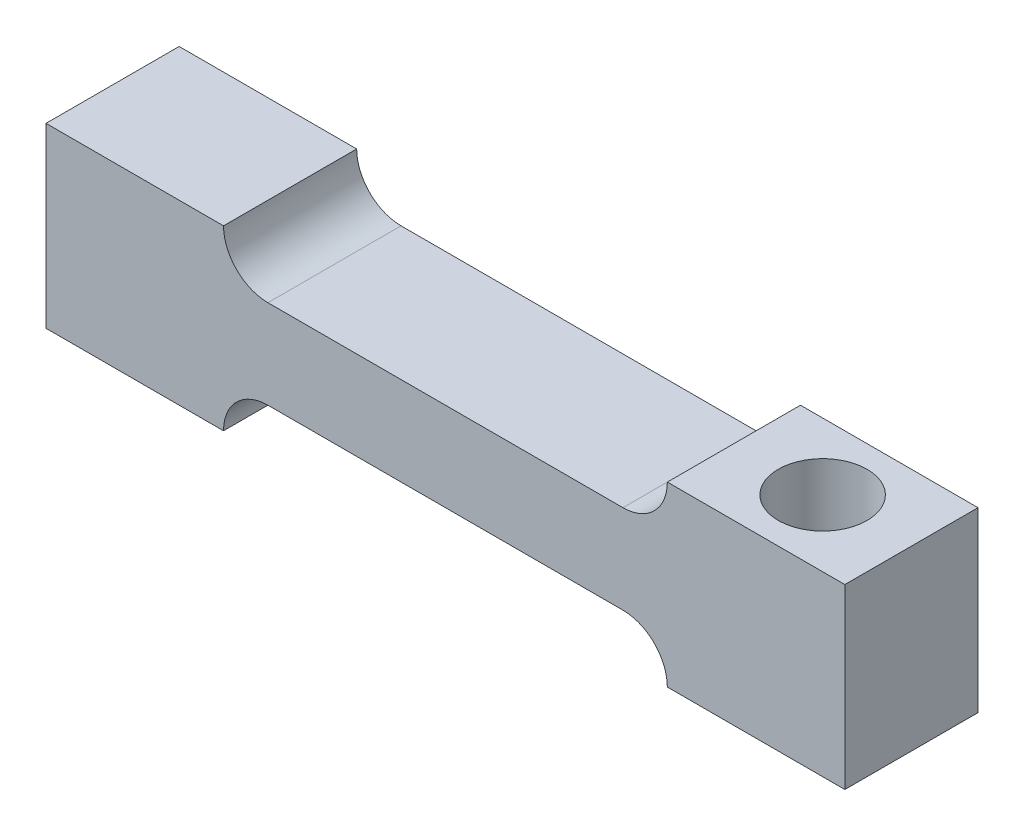
ISO-10303-21;
HEADER;
FILE_DESCRIPTION(('STEP AP214'),'2;1');
FILE_NAME('part.step','',(''),(''),'','','');
FILE_SCHEMA(('AUTOMOTIVE_DESIGN { 1 0 10303 214 1 1 1 1 }'));
ENDSEC;
DATA;
#1=APPLICATION_CONTEXT('core data for automotive mechanical design processes');
#2=APPLICATION_PROTOCOL_DEFINITION('international standard','automotive_design',2000,#1);
#3=PRODUCT_CONTEXT('',#1,'mechanical');
#4=PRODUCT('Part','Part','',(#3));
#5=PRODUCT_RELATED_PRODUCT_CATEGORY('part','',(#4));
#6=PRODUCT_DEFINITION_FORMATION('','',#4);
#7=PRODUCT_DEFINITION_CONTEXT('part definition',#1,'design');
#8=PRODUCT_DEFINITION('design','',#6,#7);
#9=PRODUCT_DEFINITION_SHAPE('','',#8);
#10=(LENGTH_UNIT() NAMED_UNIT(*) SI_UNIT(.MILLI.,.METRE.));
#11=(NAMED_UNIT(*) PLANE_ANGLE_UNIT() SI_UNIT($,.RADIAN.));
#12=(NAMED_UNIT(*) SI_UNIT($,.STERADIAN.) SOLID_ANGLE_UNIT());
#13=UNCERTAINTY_MEASURE_WITH_UNIT(LENGTH_MEASURE(1.E-05),#10,'distance_accuracy_value','');
#14=(GEOMETRIC_REPRESENTATION_CONTEXT(3) GLOBAL_UNCERTAINTY_ASSIGNED_CONTEXT((#13)) GLOBAL_UNIT_ASSIGNED_CONTEXT((#10,
#11,#12)) REPRESENTATION_CONTEXT('',''));
#15=CARTESIAN_POINT('',(0.,0.,0.));
#16=DIRECTION('',(0.,0.,1.));
#17=DIRECTION('',(1.,0.,0.));
#18=AXIS2_PLACEMENT_3D('',#15,#16,#17);
#19=CARTESIAN_POINT('',(0.,0.,30.));
#20=DIRECTION('',(-1.,0.,0.));
#21=DIRECTION('',(0.,0.,1.));
#22=AXIS2_PLACEMENT_3D('',#19,#20,#21);
#23=PLANE('',#22);
#24=DIRECTION('',(0.,1.,0.));
#25=VECTOR('',#24,1.);
#26=CARTESIAN_POINT('',(0.,0.,0.));
#27=LINE('',#26,#25);
#28=CARTESIAN_POINT('',(0.,-30.,0.));
#29=VERTEX_POINT('',#28);
#30=CARTESIAN_POINT('',(0.,10.,0.));
#31=VERTEX_POINT('',#30);
#32=EDGE_CURVE('E137',#29,#31,#27,.T.);
#33=ORIENTED_EDGE('',*,*,#32,.T.);
#34=DIRECTION('',(0.,0.,-1.));
#35=VECTOR('',#34,1.);
#36=CARTESIAN_POINT('',(0.,10.,30.));
#37=LINE('',#36,#35);
#38=CARTESIAN_POINT('',(0.,10.,30.));
#39=VERTEX_POINT('',#38);
#40=EDGE_CURVE('E136',#39,#31,#37,.T.);
#41=ORIENTED_EDGE('',*,*,#40,.F.);
#42=DIRECTION('',(0.,1.,0.));
#43=VECTOR('',#42,1.);
#44=CARTESIAN_POINT('',(0.,-30.,30.));
#45=LINE('',#44,#43);
#46=CARTESIAN_POINT('',(0.,-30.,30.));
#47=VERTEX_POINT('',#46);
#48=EDGE_CURVE('E122',#47,#39,#45,.T.);
#49=ORIENTED_EDGE('',*,*,#48,.F.);
#50=DIRECTION('',(0.,0.,-1.));
#51=VECTOR('',#50,1.);
#52=CARTESIAN_POINT('',(0.,-30.,30.));
#53=LINE('',#52,#51);
#54=EDGE_CURVE('E161',#47,#29,#53,.T.);
#55=ORIENTED_EDGE('',*,*,#54,.T.);
#56=EDGE_LOOP('',(#33,#41,#49,#55));
#57=FACE_BOUND('',#56,.T.);
#58=ADVANCED_FACE('F35',(#57),#23,.F.);
#59=CARTESIAN_POINT('',(0.,10.,30.));
#60=DIRECTION('',(0.,-1.,0.));
#61=DIRECTION('',(1.,0.,0.));
#62=AXIS2_PLACEMENT_3D('',#59,#60,#61);
#63=PLANE('',#62);
#64=CARTESIAN_POINT('',(-20.,10.,15.));
#65=DIRECTION('',(0.,1.,0.));
#66=DIRECTION('',(-1.,0.,0.));
#67=AXIS2_PLACEMENT_3D('',#64,#65,#66);
#68=CIRCLE('',#67,10.);
#69=CARTESIAN_POINT('',(-30.,9.99999999999999,15.));
#70=VERTEX_POINT('',#69);
#71=EDGE_CURVE('E386',#70,#70,#68,.T.);
#72=ORIENTED_EDGE('',*,*,#71,.F.);
#73=EDGE_LOOP('',(#72));
#74=FACE_BOUND('',#73,.T.);
#75=DIRECTION('',(-1.,0.,0.));
#76=VECTOR('',#75,1.);
#77=CARTESIAN_POINT('',(0.,10.,0.));
#78=LINE('',#77,#76);
#79=CARTESIAN_POINT('',(-40.,9.99999999999999,0.));
#80=VERTEX_POINT('',#79);
#81=EDGE_CURVE('E163',#31,#80,#78,.T.);
#82=ORIENTED_EDGE('',*,*,#81,.T.);
#83=DIRECTION('',(0.,0.,-1.));
#84=VECTOR('',#83,1.);
#85=CARTESIAN_POINT('',(-40.,9.99999999999999,30.));
#86=LINE('',#85,#84);
#87=CARTESIAN_POINT('',(-40.,9.99999999999999,30.));
#88=VERTEX_POINT('',#87);
#89=EDGE_CURVE('E142',#88,#80,#86,.T.);
#90=ORIENTED_EDGE('',*,*,#89,.F.);
#91=DIRECTION('',(-1.,0.,0.));
#92=VECTOR('',#91,1.);
#93=CARTESIAN_POINT('',(0.,10.,30.));
#94=LINE('',#93,#92);
#95=EDGE_CURVE('E126',#39,#88,#94,.T.);
#96=ORIENTED_EDGE('',*,*,#95,.F.);
#97=ORIENTED_EDGE('',*,*,#40,.T.);
#98=EDGE_LOOP('',(#82,#90,#96,#97));
#99=FACE_BOUND('',#98,.T.);
#100=ADVANCED_FACE('F144',(#74,#99),#63,.F.);
#101=CARTESIAN_POINT('',(-40.,0.,30.));
#102=DIRECTION('',(0.,-1.,0.));
#103=DIRECTION('',(1.,0.,0.));
#104=AXIS2_PLACEMENT_3D('',#101,#102,#103);
#105=PLANE('',#104);
#106=DIRECTION('',(-1.,0.,0.));
#107=VECTOR('',#106,1.);
#108=CARTESIAN_POINT('',(-40.,0.,30.));
#109=LINE('',#108,#107);
#110=CARTESIAN_POINT('',(-50.,0.,30.));
#111=VERTEX_POINT('',#110);
#112=CARTESIAN_POINT('',(-130.,0.,30.));
#113=VERTEX_POINT('',#112);
#114=EDGE_CURVE('E146',#111,#113,#109,.T.);
#115=ORIENTED_EDGE('',*,*,#114,.F.);
#116=DIRECTION('',(0.,0.,-1.));
#117=VECTOR('',#116,1.);
#118=CARTESIAN_POINT('',(-50.,0.,0.));
#119=LINE('',#118,#117);
#120=CARTESIAN_POINT('',(-50.,0.,0.));
#121=VERTEX_POINT('',#120);
#122=EDGE_CURVE('E202',#111,#121,#119,.T.);
#123=ORIENTED_EDGE('',*,*,#122,.T.);
#124=DIRECTION('',(-1.,0.,0.));
#125=VECTOR('',#124,1.);
#126=CARTESIAN_POINT('',(-40.,0.,0.));
#127=LINE('',#126,#125);
#128=CARTESIAN_POINT('',(-130.,0.,0.));
#129=VERTEX_POINT('',#128);
#130=EDGE_CURVE('E166',#121,#129,#127,.T.);
#131=ORIENTED_EDGE('',*,*,#130,.T.);
#132=DIRECTION('',(0.,0.,-1.));
#133=VECTOR('',#132,1.);
#134=CARTESIAN_POINT('',(-130.,0.,30.));
#135=LINE('',#134,#133);
#136=EDGE_CURVE('E50',#129,#113,#135,.F.);
#137=ORIENTED_EDGE('',*,*,#136,.T.);
#138=EDGE_LOOP('',(#115,#123,#131,#137));
#139=FACE_BOUND('',#138,.T.);
#140=ADVANCED_FACE('F222',(#139),#105,.F.);
#141=CARTESIAN_POINT('',(-140.,9.99999999999999,30.));
#142=DIRECTION('',(0.,-1.,0.));
#143=DIRECTION('',(1.,0.,0.));
#144=AXIS2_PLACEMENT_3D('',#141,#142,#143);
#145=PLANE('',#144);
#146=DIRECTION('',(-1.,0.,0.));
#147=VECTOR('',#146,1.);
#148=CARTESIAN_POINT('',(-140.,9.99999999999999,0.));
#149=LINE('',#148,#147);
#150=CARTESIAN_POINT('',(-140.,9.99999999999999,0.));
#151=VERTEX_POINT('',#150);
#152=CARTESIAN_POINT('',(-180.,9.99999999999999,0.));
#153=VERTEX_POINT('',#152);
#154=EDGE_CURVE('E168',#151,#153,#149,.T.);
#155=ORIENTED_EDGE('',*,*,#154,.T.);
#156=DIRECTION('',(0.,0.,-1.));
#157=VECTOR('',#156,1.);
#158=CARTESIAN_POINT('',(-180.,9.99999999999999,30.));
#159=LINE('',#158,#157);
#160=CARTESIAN_POINT('',(-180.,9.99999999999999,30.));
#161=VERTEX_POINT('',#160);
#162=EDGE_CURVE('E190',#161,#153,#159,.T.);
#163=ORIENTED_EDGE('',*,*,#162,.F.);
#164=DIRECTION('',(-1.,0.,0.));
#165=VECTOR('',#164,1.);
#166=CARTESIAN_POINT('',(-140.,9.99999999999999,30.));
#167=LINE('',#166,#165);
#168=CARTESIAN_POINT('',(-140.,9.99999999999999,30.));
#169=VERTEX_POINT('',#168);
#170=EDGE_CURVE('E148',#169,#161,#167,.T.);
#171=ORIENTED_EDGE('',*,*,#170,.F.);
#172=DIRECTION('',(0.,0.,-1.));
#173=VECTOR('',#172,1.);
#174=CARTESIAN_POINT('',(-140.,9.99999999999999,30.));
#175=LINE('',#174,#173);
#176=EDGE_CURVE('E193',#169,#151,#175,.T.);
#177=ORIENTED_EDGE('',*,*,#176,.T.);
#178=EDGE_LOOP('',(#155,#163,#171,#177));
#179=FACE_BOUND('',#178,.T.);
#180=ADVANCED_FACE('F228',(#179),#145,.F.);
#181=CARTESIAN_POINT('',(-180.,9.99999999999999,30.));
#182=DIRECTION('',(1.,0.,0.));
#183=DIRECTION('',(0.,0.,-1.));
#184=AXIS2_PLACEMENT_3D('',#181,#182,#183);
#185=PLANE('',#184);
#186=DIRECTION('',(0.,-1.,0.));
#187=VECTOR('',#186,1.);
#188=CARTESIAN_POINT('',(-180.,9.99999999999999,0.));
#189=LINE('',#188,#187);
#190=CARTESIAN_POINT('',(-180.,-30.,0.));
#191=VERTEX_POINT('',#190);
#192=EDGE_CURVE('E170',#153,#191,#189,.T.);
#193=ORIENTED_EDGE('',*,*,#192,.T.);
#194=DIRECTION('',(0.,0.,-1.));
#195=VECTOR('',#194,1.);
#196=CARTESIAN_POINT('',(-180.,-30.,30.));
#197=LINE('',#196,#195);
#198=CARTESIAN_POINT('',(-180.,-30.,30.));
#199=VERTEX_POINT('',#198);
#200=EDGE_CURVE('E187',#199,#191,#197,.T.);
#201=ORIENTED_EDGE('',*,*,#200,.F.);
#202=DIRECTION('',(0.,-1.,0.));
#203=VECTOR('',#202,1.);
#204=CARTESIAN_POINT('',(-180.,9.99999999999999,30.));
#205=LINE('',#204,#203);
#206=EDGE_CURVE('E153',#161,#199,#205,.T.);
#207=ORIENTED_EDGE('',*,*,#206,.F.);
#208=ORIENTED_EDGE('',*,*,#162,.T.);
#209=EDGE_LOOP('',(#193,#201,#207,#208));
#210=FACE_BOUND('',#209,.T.);
#211=ADVANCED_FACE('F232',(#210),#185,.F.);
#212=CARTESIAN_POINT('',(-180.,-30.,30.));
#213=DIRECTION('',(0.,1.,0.));
#214=DIRECTION('',(0.,0.,1.));
#215=AXIS2_PLACEMENT_3D('',#212,#213,#214);
#216=PLANE('',#215);
#217=DIRECTION('',(1.,0.,0.));
#218=VECTOR('',#217,1.);
#219=CARTESIAN_POINT('',(-180.,-30.,0.));
#220=LINE('',#219,#218);
#221=CARTESIAN_POINT('',(-140.,-30.,0.));
#222=VERTEX_POINT('',#221);
#223=EDGE_CURVE('E172',#191,#222,#220,.T.);
#224=ORIENTED_EDGE('',*,*,#223,.T.);
#225=DIRECTION('',(0.,0.,-1.));
#226=VECTOR('',#225,1.);
#227=CARTESIAN_POINT('',(-140.,-30.,30.));
#228=LINE('',#227,#226);
#229=CARTESIAN_POINT('',(-140.,-30.,30.));
#230=VERTEX_POINT('',#229);
#231=EDGE_CURVE('E184',#230,#222,#228,.T.);
#232=ORIENTED_EDGE('',*,*,#231,.F.);
#233=DIRECTION('',(1.,0.,0.));
#234=VECTOR('',#233,1.);
#235=CARTESIAN_POINT('',(-180.,-30.,30.));
#236=LINE('',#235,#234);
#237=EDGE_CURVE('E155',#199,#230,#236,.T.);
#238=ORIENTED_EDGE('',*,*,#237,.F.);
#239=ORIENTED_EDGE('',*,*,#200,.T.);
#240=EDGE_LOOP('',(#224,#232,#238,#239));
#241=FACE_BOUND('',#240,.T.);
#242=ADVANCED_FACE('F238',(#241),#216,.F.);
#243=CARTESIAN_POINT('',(-140.,-20.,30.));
#244=DIRECTION('',(0.,1.,0.));
#245=DIRECTION('',(-1.,0.,0.));
#246=AXIS2_PLACEMENT_3D('',#243,#244,#245);
#247=PLANE('',#246);
#248=DIRECTION('',(1.,0.,0.));
#249=VECTOR('',#248,1.);
#250=CARTESIAN_POINT('',(-140.,-20.,0.));
#251=LINE('',#250,#249);
#252=CARTESIAN_POINT('',(-130.,-20.,0.));
#253=VERTEX_POINT('',#252);
#254=CARTESIAN_POINT('',(-50.,-20.,0.));
#255=VERTEX_POINT('',#254);
#256=EDGE_CURVE('E175',#253,#255,#251,.T.);
#257=ORIENTED_EDGE('',*,*,#256,.T.);
#258=DIRECTION('',(0.,0.,-1.));
#259=VECTOR('',#258,1.);
#260=CARTESIAN_POINT('',(-50.,-20.,30.));
#261=LINE('',#260,#259);
#262=CARTESIAN_POINT('',(-50.,-20.,30.));
#263=VERTEX_POINT('',#262);
#264=EDGE_CURVE('E199',#255,#263,#261,.F.);
#265=ORIENTED_EDGE('',*,*,#264,.T.);
#266=DIRECTION('',(1.,0.,0.));
#267=VECTOR('',#266,1.);
#268=CARTESIAN_POINT('',(-140.,-20.,30.));
#269=LINE('',#268,#267);
#270=CARTESIAN_POINT('',(-130.,-20.,30.));
#271=VERTEX_POINT('',#270);
#272=EDGE_CURVE('E157',#271,#263,#269,.T.);
#273=ORIENTED_EDGE('',*,*,#272,.F.);
#274=DIRECTION('',(0.,0.,-1.));
#275=VECTOR('',#274,1.);
#276=CARTESIAN_POINT('',(-130.,-20.,0.));
#277=LINE('',#276,#275);
#278=EDGE_CURVE('E141',#271,#253,#277,.T.);
#279=ORIENTED_EDGE('',*,*,#278,.T.);
#280=EDGE_LOOP('',(#257,#265,#273,#279));
#281=FACE_BOUND('',#280,.T.);
#282=ADVANCED_FACE('F245',(#281),#247,.F.);
#283=CARTESIAN_POINT('',(-40.,-30.,30.));
#284=DIRECTION('',(0.,1.,0.));
#285=DIRECTION('',(0.,0.,1.));
#286=AXIS2_PLACEMENT_3D('',#283,#284,#285);
#287=PLANE('',#286);
#288=CARTESIAN_POINT('',(-20.,-30.,15.));
#289=DIRECTION('',(0.,1.,0.));
#290=DIRECTION('',(-1.,0.,0.));
#291=AXIS2_PLACEMENT_3D('',#288,#289,#290);
#292=CIRCLE('',#291,10.);
#293=CARTESIAN_POINT('',(-30.,-30.,15.));
#294=VERTEX_POINT('',#293);
#295=EDGE_CURVE('E164',#294,#294,#292,.T.);
#296=ORIENTED_EDGE('',*,*,#295,.T.);
#297=EDGE_LOOP('',(#296));
#298=FACE_BOUND('',#297,.T.);
#299=DIRECTION('',(1.,0.,0.));
#300=VECTOR('',#299,1.);
#301=CARTESIAN_POINT('',(-40.,-30.,0.));
#302=LINE('',#301,#300);
#303=CARTESIAN_POINT('',(-40.,-30.,0.));
#304=VERTEX_POINT('',#303);
#305=EDGE_CURVE('E133',#304,#29,#302,.T.);
#306=ORIENTED_EDGE('',*,*,#305,.T.);
#307=ORIENTED_EDGE('',*,*,#54,.F.);
#308=DIRECTION('',(1.,0.,0.));
#309=VECTOR('',#308,1.);
#310=CARTESIAN_POINT('',(-40.,-30.,30.));
#311=LINE('',#310,#309);
#312=CARTESIAN_POINT('',(-40.,-30.,30.));
#313=VERTEX_POINT('',#312);
#314=EDGE_CURVE('E129',#313,#47,#311,.T.);
#315=ORIENTED_EDGE('',*,*,#314,.F.);
#316=DIRECTION('',(0.,0.,-1.));
#317=VECTOR('',#316,1.);
#318=CARTESIAN_POINT('',(-40.,-30.,30.));
#319=LINE('',#318,#317);
#320=EDGE_CURVE('E181',#313,#304,#319,.T.);
#321=ORIENTED_EDGE('',*,*,#320,.T.);
#322=EDGE_LOOP('',(#306,#307,#315,#321));
#323=FACE_BOUND('',#322,.T.);
#324=ADVANCED_FACE('F253',(#298,#323),#287,.F.);
#325=CARTESIAN_POINT('',(0.,0.,30.));
#326=DIRECTION('',(0.,0.,1.));
#327=DIRECTION('',(1.,0.,0.));
#328=AXIS2_PLACEMENT_3D('',#325,#326,#327);
#329=PLANE('',#328);
#330=ORIENTED_EDGE('',*,*,#48,.T.);
#331=ORIENTED_EDGE('',*,*,#95,.T.);
#332=CARTESIAN_POINT('',(-50.,10.,30.));
#333=DIRECTION('',(0.,0.,1.));
#334=DIRECTION('',(1.,0.,0.));
#335=AXIS2_PLACEMENT_3D('',#332,#333,#334);
#336=CIRCLE('',#335,10.);
#337=EDGE_CURVE('E57',#88,#111,#336,.F.);
#338=ORIENTED_EDGE('',*,*,#337,.T.);
#339=ORIENTED_EDGE('',*,*,#114,.T.);
#340=CARTESIAN_POINT('',(-130.,9.99999999999999,30.));
#341=DIRECTION('',(0.,0.,1.));
#342=DIRECTION('',(1.,0.,0.));
#343=AXIS2_PLACEMENT_3D('',#340,#341,#342);
#344=CIRCLE('',#343,10.);
#345=EDGE_CURVE('E12',#113,#169,#344,.F.);
#346=ORIENTED_EDGE('',*,*,#345,.T.);
#347=ORIENTED_EDGE('',*,*,#170,.T.);
#348=ORIENTED_EDGE('',*,*,#206,.T.);
#349=ORIENTED_EDGE('',*,*,#237,.T.);
#350=CARTESIAN_POINT('',(-130.,-30.,30.));
#351=DIRECTION('',(0.,0.,1.));
#352=DIRECTION('',(1.,0.,0.));
#353=AXIS2_PLACEMENT_3D('',#350,#351,#352);
#354=CIRCLE('',#353,10.);
#355=EDGE_CURVE('E211',#230,#271,#354,.F.);
#356=ORIENTED_EDGE('',*,*,#355,.T.);
#357=ORIENTED_EDGE('',*,*,#272,.T.);
#358=CARTESIAN_POINT('',(-50.,-30.,30.));
#359=DIRECTION('',(0.,0.,1.));
#360=DIRECTION('',(1.,0.,0.));
#361=AXIS2_PLACEMENT_3D('',#358,#359,#360);
#362=CIRCLE('',#361,10.);
#363=EDGE_CURVE('E207',#263,#313,#362,.F.);
#364=ORIENTED_EDGE('',*,*,#363,.T.);
#365=ORIENTED_EDGE('',*,*,#314,.T.);
#366=EDGE_LOOP('',(#330,#331,#338,#339,#346,#347,#348,#349,#356,#357,#364,#365));
#367=FACE_BOUND('',#366,.T.);
#368=ADVANCED_FACE('F124',(#367),#329,.T.);
#369=CARTESIAN_POINT('',(0.,0.,0.));
#370=DIRECTION('',(0.,0.,1.));
#371=DIRECTION('',(1.,0.,0.));
#372=AXIS2_PLACEMENT_3D('',#369,#370,#371);
#373=PLANE('',#372);
#374=ORIENTED_EDGE('',*,*,#32,.F.);
#375=ORIENTED_EDGE('',*,*,#305,.F.);
#376=CARTESIAN_POINT('',(-50.,-30.,0.));
#377=DIRECTION('',(0.,0.,1.));
#378=DIRECTION('',(1.,0.,0.));
#379=AXIS2_PLACEMENT_3D('',#376,#377,#378);
#380=CIRCLE('',#379,10.);
#381=EDGE_CURVE('E205',#304,#255,#380,.T.);
#382=ORIENTED_EDGE('',*,*,#381,.T.);
#383=ORIENTED_EDGE('',*,*,#256,.F.);
#384=CARTESIAN_POINT('',(-130.,-30.,0.));
#385=DIRECTION('',(0.,0.,1.));
#386=DIRECTION('',(1.,0.,0.));
#387=AXIS2_PLACEMENT_3D('',#384,#385,#386);
#388=CIRCLE('',#387,10.);
#389=EDGE_CURVE('E209',#253,#222,#388,.T.);
#390=ORIENTED_EDGE('',*,*,#389,.T.);
#391=ORIENTED_EDGE('',*,*,#223,.F.);
#392=ORIENTED_EDGE('',*,*,#192,.F.);
#393=ORIENTED_EDGE('',*,*,#154,.F.);
#394=CARTESIAN_POINT('',(-130.,9.99999999999999,0.));
#395=DIRECTION('',(0.,0.,1.));
#396=DIRECTION('',(1.,0.,0.));
#397=AXIS2_PLACEMENT_3D('',#394,#395,#396);
#398=CIRCLE('',#397,10.);
#399=EDGE_CURVE('E43',#151,#129,#398,.T.);
#400=ORIENTED_EDGE('',*,*,#399,.T.);
#401=ORIENTED_EDGE('',*,*,#130,.F.);
#402=CARTESIAN_POINT('',(-50.,10.,0.));
#403=DIRECTION('',(0.,0.,1.));
#404=DIRECTION('',(1.,0.,0.));
#405=AXIS2_PLACEMENT_3D('',#402,#403,#404);
#406=CIRCLE('',#405,10.);
#407=EDGE_CURVE('E213',#121,#80,#406,.T.);
#408=ORIENTED_EDGE('',*,*,#407,.T.);
#409=ORIENTED_EDGE('',*,*,#81,.F.);
#410=EDGE_LOOP('',(#374,#375,#382,#383,#390,#391,#392,#393,#400,#401,#408,#409));
#411=FACE_BOUND('',#410,.T.);
#412=ADVANCED_FACE('F218',(#411),#373,.F.);
#413=CARTESIAN_POINT('',(-50.,-30.,30.));
#414=DIRECTION('',(0.,0.,1.));
#415=DIRECTION('',(1.,0.,0.));
#416=AXIS2_PLACEMENT_3D('',#413,#414,#415);
#417=CYLINDRICAL_SURFACE('',#416,10.);
#418=ORIENTED_EDGE('',*,*,#363,.F.);
#419=ORIENTED_EDGE('',*,*,#264,.F.);
#420=ORIENTED_EDGE('',*,*,#381,.F.);
#421=ORIENTED_EDGE('',*,*,#320,.F.);
#422=EDGE_LOOP('',(#418,#419,#420,#421));
#423=FACE_BOUND('',#422,.T.);
#424=ADVANCED_FACE('F251',(#423),#417,.F.);
#425=CARTESIAN_POINT('',(-130.,-30.,30.));
#426=DIRECTION('',(0.,0.,1.));
#427=DIRECTION('',(1.,0.,0.));
#428=AXIS2_PLACEMENT_3D('',#425,#426,#427);
#429=CYLINDRICAL_SURFACE('',#428,10.);
#430=ORIENTED_EDGE('',*,*,#355,.F.);
#431=ORIENTED_EDGE('',*,*,#231,.T.);
#432=ORIENTED_EDGE('',*,*,#389,.F.);
#433=ORIENTED_EDGE('',*,*,#278,.F.);
#434=EDGE_LOOP('',(#430,#431,#432,#433));
#435=FACE_BOUND('',#434,.T.);
#436=ADVANCED_FACE('F242',(#435),#429,.F.);
#437=CARTESIAN_POINT('',(-50.,10.,30.));
#438=DIRECTION('',(0.,0.,1.));
#439=DIRECTION('',(1.,0.,0.));
#440=AXIS2_PLACEMENT_3D('',#437,#438,#439);
#441=CYLINDRICAL_SURFACE('',#440,10.);
#442=ORIENTED_EDGE('',*,*,#337,.F.);
#443=ORIENTED_EDGE('',*,*,#89,.T.);
#444=ORIENTED_EDGE('',*,*,#407,.F.);
#445=ORIENTED_EDGE('',*,*,#122,.F.);
#446=EDGE_LOOP('',(#442,#443,#444,#445));
#447=FACE_BOUND('',#446,.T.);
#448=ADVANCED_FACE('F277',(#447),#441,.F.);
#449=CARTESIAN_POINT('',(-130.,9.99999999999999,30.));
#450=DIRECTION('',(0.,0.,1.));
#451=DIRECTION('',(1.,0.,0.));
#452=AXIS2_PLACEMENT_3D('',#449,#450,#451);
#453=CYLINDRICAL_SURFACE('',#452,10.);
#454=ORIENTED_EDGE('',*,*,#345,.F.);
#455=ORIENTED_EDGE('',*,*,#136,.F.);
#456=ORIENTED_EDGE('',*,*,#399,.F.);
#457=ORIENTED_EDGE('',*,*,#176,.F.);
#458=EDGE_LOOP('',(#454,#455,#456,#457));
#459=FACE_BOUND('',#458,.T.);
#460=ADVANCED_FACE('F37',(#459),#453,.F.);
#461=CARTESIAN_POINT('',(-20.,-30.,15.));
#462=DIRECTION('',(0.,1.,0.));
#463=DIRECTION('',(-1.,0.,0.));
#464=AXIS2_PLACEMENT_3D('',#461,#462,#463);
#465=CYLINDRICAL_SURFACE('',#464,10.);
#466=CARTESIAN_POINT('',(-30.,-30.,15.));
#467=CARTESIAN_POINT('',(-30.,-29.5833333333333,15.));
#468=CARTESIAN_POINT('',(-30.,-29.1666666666667,15.));
#469=CARTESIAN_POINT('',(-30.,-28.3333333333334,15.));
#470=CARTESIAN_POINT('',(-30.,-27.9166666666667,15.));
#471=CARTESIAN_POINT('',(-30.,-27.0833333333333,15.));
#472=CARTESIAN_POINT('',(-30.,-26.6666666666667,15.));
#473=CARTESIAN_POINT('',(-30.,-25.8333333333333,15.));
#474=CARTESIAN_POINT('',(-30.,-25.4166666666667,15.));
#475=CARTESIAN_POINT('',(-30.,-24.5833333333333,15.));
#476=CARTESIAN_POINT('',(-30.,-24.1666666666667,15.));
#477=CARTESIAN_POINT('',(-30.,-23.3333333333333,15.));
#478=CARTESIAN_POINT('',(-30.,-22.9166666666667,15.));
#479=CARTESIAN_POINT('',(-30.,-22.0833333333333,15.));
#480=CARTESIAN_POINT('',(-30.,-21.6666666666667,15.));
#481=CARTESIAN_POINT('',(-30.,-20.8333333333333,15.));
#482=CARTESIAN_POINT('',(-30.,-20.4166666666667,15.));
#483=CARTESIAN_POINT('',(-30.,-19.5833333333333,15.));
#484=CARTESIAN_POINT('',(-30.,-19.1666666666667,15.));
#485=CARTESIAN_POINT('',(-30.,-18.3333333333333,15.));
#486=CARTESIAN_POINT('',(-30.,-17.9166666666667,15.));
#487=CARTESIAN_POINT('',(-30.,-17.0833333333333,15.));
#488=CARTESIAN_POINT('',(-30.,-16.6666666666667,15.));
#489=CARTESIAN_POINT('',(-30.,-15.8333333333333,15.));
#490=CARTESIAN_POINT('',(-30.,-15.4166666666667,15.));
#491=CARTESIAN_POINT('',(-30.,-14.5833333333333,15.));
#492=CARTESIAN_POINT('',(-30.,-14.1666666666667,15.));
#493=CARTESIAN_POINT('',(-30.,-13.3333333333333,15.));
#494=CARTESIAN_POINT('',(-30.,-12.9166666666667,15.));
#495=CARTESIAN_POINT('',(-30.,-12.0833333333333,15.));
#496=CARTESIAN_POINT('',(-30.,-11.6666666666667,15.));
#497=CARTESIAN_POINT('',(-30.,-10.8333333333333,15.));
#498=CARTESIAN_POINT('',(-30.,-10.4166666666667,15.));
#499=CARTESIAN_POINT('',(-30.,-9.58333333333334,15.));
#500=CARTESIAN_POINT('',(-30.,-9.16666666666667,15.));
#501=CARTESIAN_POINT('',(-30.,-8.33333333333334,15.));
#502=CARTESIAN_POINT('',(-30.,-7.91666666666667,15.));
#503=CARTESIAN_POINT('',(-30.,-7.08333333333334,15.));
#504=CARTESIAN_POINT('',(-30.,-6.66666666666667,15.));
#505=CARTESIAN_POINT('',(-30.,-5.83333333333334,15.));
#506=CARTESIAN_POINT('',(-30.,-5.41666666666667,15.));
#507=CARTESIAN_POINT('',(-30.,-4.58333333333334,15.));
#508=CARTESIAN_POINT('',(-30.,-4.16666666666667,15.));
#509=CARTESIAN_POINT('',(-30.,-3.33333333333334,15.));
#510=CARTESIAN_POINT('',(-30.,-2.91666666666667,15.));
#511=CARTESIAN_POINT('',(-30.,-2.08333333333334,15.));
#512=CARTESIAN_POINT('',(-30.,-1.66666666666667,15.));
#513=CARTESIAN_POINT('',(-30.,-0.833333333333338,15.));
#514=CARTESIAN_POINT('',(-30.,-0.416666666666671,15.));
#515=CARTESIAN_POINT('',(-30.,0.41666666666666,15.));
#516=CARTESIAN_POINT('',(-30.,0.833333333333324,15.));
#517=CARTESIAN_POINT('',(-30.,1.66666666666665,15.));
#518=CARTESIAN_POINT('',(-30.,2.08333333333332,15.));
#519=CARTESIAN_POINT('',(-30.,2.91666666666666,15.));
#520=CARTESIAN_POINT('',(-30.,3.33333333333332,15.));
#521=CARTESIAN_POINT('',(-30.,4.16666666666666,15.));
#522=CARTESIAN_POINT('',(-30.,4.58333333333332,15.));
#523=CARTESIAN_POINT('',(-30.,5.41666666666666,15.));
#524=CARTESIAN_POINT('',(-30.,5.83333333333333,15.));
#525=CARTESIAN_POINT('',(-30.,6.66666666666666,15.));
#526=CARTESIAN_POINT('',(-30.,7.08333333333333,15.));
#527=CARTESIAN_POINT('',(-30.,7.91666666666666,15.));
#528=CARTESIAN_POINT('',(-30.,8.33333333333333,15.));
#529=CARTESIAN_POINT('',(-30.,9.16666666666666,15.));
#530=CARTESIAN_POINT('',(-30.,9.58333333333333,15.));
#531=CARTESIAN_POINT('',(-30.,9.99999999999999,15.));
#532=B_SPLINE_CURVE_WITH_KNOTS('',3,(#466,#467,#468,#469,#470,#471,#472,#473,#474,#475,#476,
#477,#478,#479,#480,#481,#482,#483,#484,#485,#486,#487,#488,#489,#490,#491,#492,#493,#494,#495,
#496,#497,#498,#499,#500,#501,#502,#503,#504,#505,#506,#507,#508,#509,#510,#511,#512,#513,#514,
#515,#516,#517,#518,#519,#520,#521,#522,#523,#524,#525,#526,#527,#528,#529,#530,#531),
.UNSPECIFIED.,.F.,.F.,(4,2,2,2,2,2,2,2,2,2,2,2,2,2,2,2,2,2,2,2,2,2,2,2,2,2,2,2,2,2,2,2,4),(0.,
1.25,2.5,3.75,5.,6.25,7.5,8.75,10.,11.25,12.5,13.75,15.,16.25,17.5,18.75,20.,21.25,22.5,23.75,
25.,26.25,27.5,28.75,30.,31.25,32.5,33.75,35.,36.25,37.5,38.75,40.),.UNSPECIFIED.);
#533=EDGE_CURVE('BSEAM283',#294,#70,#532,.T.);
#534=ORIENTED_EDGE('',*,*,#295,.F.);
#535=ORIENTED_EDGE('',*,*,#71,.T.);
#536=ORIENTED_EDGE('',*,*,#533,.T.);
#537=ORIENTED_EDGE('',*,*,#533,.F.);
#538=EDGE_LOOP('',(#534,#536,#535,#537));
#539=FACE_BOUND('',#538,.T.);
#540=ADVANCED_FACE('F283',(#539),#465,.F.);
#541=CLOSED_SHELL('',(#58,#100,#140,#180,#211,#242,#282,#324,#368,#412,#424,#436,#448,#460,#540));
#542=MANIFOLD_SOLID_BREP('B2',#541);
#543=ADVANCED_BREP_SHAPE_REPRESENTATION('',(#18,#542),#14);
#544=SHAPE_DEFINITION_REPRESENTATION(#9,#543);
ENDSEC;
END-ISO-10303-21;
